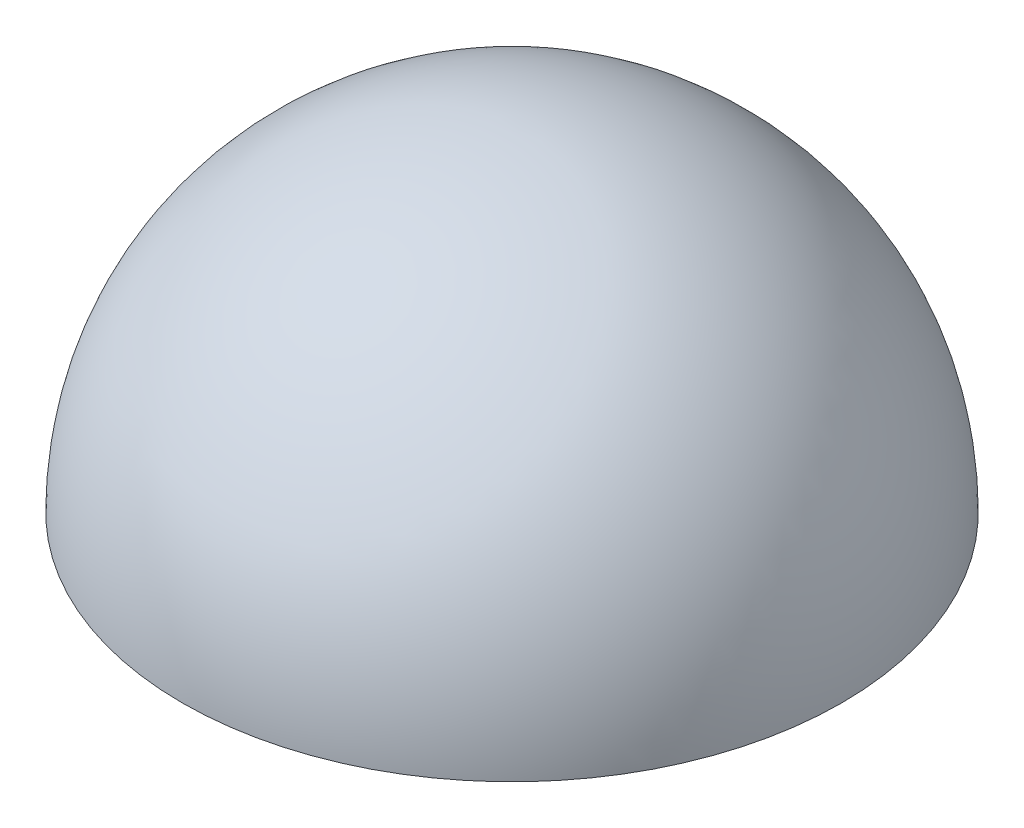
ISO-10303-21;
HEADER;
FILE_DESCRIPTION(('STEP AP214'),'2;1');
FILE_NAME('part.step','',(''),(''),'','','');
FILE_SCHEMA(('AUTOMOTIVE_DESIGN { 1 0 10303 214 1 1 1 1 }'));
ENDSEC;
DATA;
#1=APPLICATION_CONTEXT('core data for automotive mechanical design processes');
#2=APPLICATION_PROTOCOL_DEFINITION('international standard','automotive_design',2000,#1);
#3=PRODUCT_CONTEXT('',#1,'mechanical');
#4=PRODUCT('Part','Part','',(#3));
#5=PRODUCT_RELATED_PRODUCT_CATEGORY('part','',(#4));
#6=PRODUCT_DEFINITION_FORMATION('','',#4);
#7=PRODUCT_DEFINITION_CONTEXT('part definition',#1,'design');
#8=PRODUCT_DEFINITION('design','',#6,#7);
#9=PRODUCT_DEFINITION_SHAPE('','',#8);
#10=(LENGTH_UNIT() NAMED_UNIT(*) SI_UNIT(.MILLI.,.METRE.));
#11=(NAMED_UNIT(*) PLANE_ANGLE_UNIT() SI_UNIT($,.RADIAN.));
#12=(NAMED_UNIT(*) SI_UNIT($,.STERADIAN.) SOLID_ANGLE_UNIT());
#13=UNCERTAINTY_MEASURE_WITH_UNIT(LENGTH_MEASURE(1.E-05),#10,'distance_accuracy_value','');
#14=(GEOMETRIC_REPRESENTATION_CONTEXT(3) GLOBAL_UNCERTAINTY_ASSIGNED_CONTEXT((#13)) GLOBAL_UNIT_ASSIGNED_CONTEXT((#10,
#11,#12)) REPRESENTATION_CONTEXT('',''));
#15=CARTESIAN_POINT('',(0.,0.,0.));
#16=DIRECTION('',(0.,0.,1.));
#17=DIRECTION('',(1.,0.,0.));
#18=AXIS2_PLACEMENT_3D('',#15,#16,#17);
#19=CARTESIAN_POINT('',(0.,0.,0.));
#20=DIRECTION('',(0.,-1.,0.));
#21=DIRECTION('',(-1.,0.,0.));
#22=AXIS2_PLACEMENT_3D('',#19,#20,#21);
#23=SPHERICAL_SURFACE('',#22,12.7);
#24=CARTESIAN_POINT('',(0.,0.,0.));
#25=DIRECTION('',(0.,-1.,0.));
#26=DIRECTION('',(0.,0.,-1.));
#27=AXIS2_PLACEMENT_3D('',#24,#25,#26);
#28=CIRCLE('',#27,12.7);
#29=CARTESIAN_POINT('',(0.,0.,-12.7));
#30=VERTEX_POINT('',#29);
#31=EDGE_CURVE('E10',#30,#30,#28,.T.);
#32=ORIENTED_EDGE('',*,*,#31,.F.);
#33=EDGE_LOOP('',(#32));
#34=FACE_BOUND('',#33,.T.);
#35=ADVANCED_FACE('F30',(#34),#23,.T.);
#36=CARTESIAN_POINT('',(0.,0.,0.));
#37=DIRECTION('',(0.,1.,0.));
#38=DIRECTION('',(0.,0.,1.));
#39=AXIS2_PLACEMENT_3D('',#36,#37,#38);
#40=PLANE('',#39);
#41=ORIENTED_EDGE('',*,*,#31,.T.);
#42=EDGE_LOOP('',(#41));
#43=FACE_BOUND('',#42,.T.);
#44=ADVANCED_FACE('F37',(#43),#40,.F.);
#45=CLOSED_SHELL('',(#35,#44));
#46=MANIFOLD_SOLID_BREP('B2',#45);
#47=ADVANCED_BREP_SHAPE_REPRESENTATION('',(#18,#46),#14);
#48=SHAPE_DEFINITION_REPRESENTATION(#9,#47);
ENDSEC;
END-ISO-10303-21;
